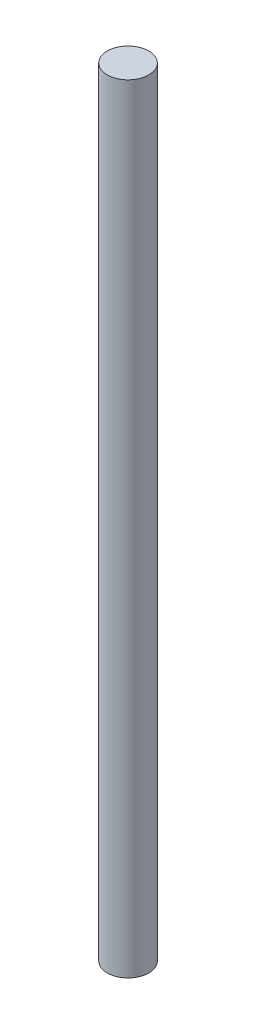
ISO-10303-21;
HEADER;
FILE_DESCRIPTION(('STEP AP214'),'2;1');
FILE_NAME('part.step','',(''),(''),'','','');
FILE_SCHEMA(('AUTOMOTIVE_DESIGN { 1 0 10303 214 1 1 1 1 }'));
ENDSEC;
DATA;
#1=APPLICATION_CONTEXT('core data for automotive mechanical design processes');
#2=APPLICATION_PROTOCOL_DEFINITION('international standard','automotive_design',2000,#1);
#3=PRODUCT_CONTEXT('',#1,'mechanical');
#4=PRODUCT('Part','Part','',(#3));
#5=PRODUCT_RELATED_PRODUCT_CATEGORY('part','',(#4));
#6=PRODUCT_DEFINITION_FORMATION('','',#4);
#7=PRODUCT_DEFINITION_CONTEXT('part definition',#1,'design');
#8=PRODUCT_DEFINITION('design','',#6,#7);
#9=PRODUCT_DEFINITION_SHAPE('','',#8);
#10=(LENGTH_UNIT() NAMED_UNIT(*) SI_UNIT(.MILLI.,.METRE.));
#11=(NAMED_UNIT(*) PLANE_ANGLE_UNIT() SI_UNIT($,.RADIAN.));
#12=(NAMED_UNIT(*) SI_UNIT($,.STERADIAN.) SOLID_ANGLE_UNIT());
#13=UNCERTAINTY_MEASURE_WITH_UNIT(LENGTH_MEASURE(1.E-05),#10,'distance_accuracy_value','');
#14=(GEOMETRIC_REPRESENTATION_CONTEXT(3) GLOBAL_UNCERTAINTY_ASSIGNED_CONTEXT((#13)) GLOBAL_UNIT_ASSIGNED_CONTEXT((#10,
#11,#12)) REPRESENTATION_CONTEXT('',''));
#15=CARTESIAN_POINT('',(0.,0.,0.));
#16=DIRECTION('',(0.,0.,1.));
#17=DIRECTION('',(1.,0.,0.));
#18=AXIS2_PLACEMENT_3D('',#15,#16,#17);
#19=CARTESIAN_POINT('',(0.,149.999999999999,0.));
#20=DIRECTION('',(0.,-0.999999999999993,0.));
#21=DIRECTION('',(0.,0.,-0.999999999999986));
#22=AXIS2_PLACEMENT_3D('',#19,#20,#21);
#23=CYLINDRICAL_SURFACE('',#22,4.);
#24=CARTESIAN_POINT('',(0.,149.999999999999,0.));
#25=DIRECTION('',(0.,0.999999999999993,0.));
#26=DIRECTION('',(0.,0.,0.999999999999986));
#27=AXIS2_PLACEMENT_3D('',#24,#25,#26);
#28=CIRCLE('',#27,4.);
#29=CARTESIAN_POINT('',(0.,149.999999999999,-3.99999999999997));
#30=VERTEX_POINT('',#29);
#31=EDGE_CURVE('E12',#30,#30,#28,.T.);
#32=CARTESIAN_POINT('',(0.,0.,0.));
#33=DIRECTION('',(0.,0.999999999999993,0.));
#34=DIRECTION('',(0.,0.,0.999999999999986));
#35=AXIS2_PLACEMENT_3D('',#32,#33,#34);
#36=CIRCLE('',#35,4.);
#37=CARTESIAN_POINT('',(0.,0.,-3.99999999999994));
#38=VERTEX_POINT('',#37);
#39=EDGE_CURVE('E45',#38,#38,#36,.T.);
#40=CARTESIAN_POINT('',(0.,149.999999999999,-3.99999999999997));
#41=CARTESIAN_POINT('',(0.,148.437499999999,-3.99999999999997));
#42=CARTESIAN_POINT('',(0.,146.874999999999,-3.99999999999997));
#43=CARTESIAN_POINT('',(0.,143.749999999999,-3.99999999999997));
#44=CARTESIAN_POINT('',(0.,142.187499999999,-3.99999999999997));
#45=CARTESIAN_POINT('',(0.,139.062499999999,-3.99999999999997));
#46=CARTESIAN_POINT('',(0.,137.499999999999,-3.99999999999997));
#47=CARTESIAN_POINT('',(0.,134.374999999999,-3.99999999999997));
#48=CARTESIAN_POINT('',(0.,132.812499999999,-3.99999999999997));
#49=CARTESIAN_POINT('',(0.,129.687499999999,-3.99999999999997));
#50=CARTESIAN_POINT('',(0.,128.124999999999,-3.99999999999997));
#51=CARTESIAN_POINT('',(0.,124.999999999999,-3.99999999999997));
#52=CARTESIAN_POINT('',(0.,123.437499999999,-3.99999999999996));
#53=CARTESIAN_POINT('',(0.,120.312499999999,-3.99999999999996));
#54=CARTESIAN_POINT('',(0.,118.749999999999,-3.99999999999996));
#55=CARTESIAN_POINT('',(0.,115.624999999999,-3.99999999999996));
#56=CARTESIAN_POINT('',(0.,114.062499999999,-3.99999999999996));
#57=CARTESIAN_POINT('',(0.,110.937499999999,-3.99999999999996));
#58=CARTESIAN_POINT('',(0.,109.374999999999,-3.99999999999996));
#59=CARTESIAN_POINT('',(0.,106.249999999999,-3.99999999999996));
#60=CARTESIAN_POINT('',(0.,104.687499999999,-3.99999999999996));
#61=CARTESIAN_POINT('',(0.,101.562499999999,-3.99999999999996));
#62=CARTESIAN_POINT('',(0.,99.9999999999994,-3.99999999999996));
#63=CARTESIAN_POINT('',(0.,96.8749999999994,-3.99999999999996));
#64=CARTESIAN_POINT('',(0.,95.3124999999994,-3.99999999999996));
#65=CARTESIAN_POINT('',(0.,92.1874999999994,-3.99999999999996));
#66=CARTESIAN_POINT('',(0.,90.6249999999994,-3.99999999999996));
#67=CARTESIAN_POINT('',(0.,87.4999999999995,-3.99999999999996));
#68=CARTESIAN_POINT('',(0.,85.9374999999995,-3.99999999999996));
#69=CARTESIAN_POINT('',(0.,82.8124999999995,-3.99999999999996));
#70=CARTESIAN_POINT('',(0.,81.2499999999995,-3.99999999999996));
#71=CARTESIAN_POINT('',(0.,78.1249999999995,-3.99999999999996));
#72=CARTESIAN_POINT('',(0.,76.5624999999995,-3.99999999999996));
#73=CARTESIAN_POINT('',(0.,73.4374999999995,-3.99999999999996));
#74=CARTESIAN_POINT('',(0.,71.8749999999995,-3.99999999999996));
#75=CARTESIAN_POINT('',(0.,68.7499999999996,-3.99999999999996));
#76=CARTESIAN_POINT('',(0.,67.1874999999996,-3.99999999999996));
#77=CARTESIAN_POINT('',(0.,64.0624999999996,-3.99999999999996));
#78=CARTESIAN_POINT('',(0.,62.4999999999996,-3.99999999999995));
#79=CARTESIAN_POINT('',(0.,59.3749999999996,-3.99999999999995));
#80=CARTESIAN_POINT('',(0.,57.8124999999996,-3.99999999999995));
#81=CARTESIAN_POINT('',(0.,54.6874999999997,-3.99999999999995));
#82=CARTESIAN_POINT('',(0.,53.1249999999997,-3.99999999999995));
#83=CARTESIAN_POINT('',(0.,49.9999999999997,-3.99999999999995));
#84=CARTESIAN_POINT('',(0.,48.4374999999997,-3.99999999999995));
#85=CARTESIAN_POINT('',(0.,45.3124999999997,-3.99999999999995));
#86=CARTESIAN_POINT('',(0.,43.7499999999997,-3.99999999999995));
#87=CARTESIAN_POINT('',(0.,40.6249999999997,-3.99999999999995));
#88=CARTESIAN_POINT('',(0.,39.0624999999998,-3.99999999999995));
#89=CARTESIAN_POINT('',(0.,35.9374999999998,-3.99999999999995));
#90=CARTESIAN_POINT('',(0.,34.3749999999998,-3.99999999999995));
#91=CARTESIAN_POINT('',(0.,31.2499999999998,-3.99999999999995));
#92=CARTESIAN_POINT('',(0.,29.6874999999998,-3.99999999999995));
#93=CARTESIAN_POINT('',(0.,26.5624999999998,-3.99999999999995));
#94=CARTESIAN_POINT('',(0.,24.9999999999998,-3.99999999999995));
#95=CARTESIAN_POINT('',(0.,21.8749999999999,-3.99999999999995));
#96=CARTESIAN_POINT('',(0.,20.3124999999999,-3.99999999999995));
#97=CARTESIAN_POINT('',(0.,17.1874999999999,-3.99999999999995));
#98=CARTESIAN_POINT('',(0.,15.6249999999999,-3.99999999999995));
#99=CARTESIAN_POINT('',(0.,12.4999999999999,-3.99999999999995));
#100=CARTESIAN_POINT('',(0.,10.9374999999999,-3.99999999999995));
#101=CARTESIAN_POINT('',(0.,7.81249999999993,-3.99999999999995));
#102=CARTESIAN_POINT('',(0.,6.24999999999994,-3.99999999999994));
#103=CARTESIAN_POINT('',(0.,3.12499999999996,-3.99999999999994));
#104=CARTESIAN_POINT('',(0.,1.56249999999997,-3.99999999999994));
#105=CARTESIAN_POINT('',(0.,0.,-3.99999999999994));
#106=B_SPLINE_CURVE_WITH_KNOTS('',3,(#40,#41,#42,#43,#44,#45,#46,#47,#48,#49,#50,#51,#52,#53,
#54,#55,#56,#57,#58,#59,#60,#61,#62,#63,#64,#65,#66,#67,#68,#69,#70,#71,#72,#73,#74,#75,#76,#77,
#78,#79,#80,#81,#82,#83,#84,#85,#86,#87,#88,#89,#90,#91,#92,#93,#94,#95,#96,#97,#98,#99,#100,
#101,#102,#103,#104,#105),.UNSPECIFIED.,.F.,.F.,(4,2,2,2,2,2,2,2,2,2,2,2,2,2,2,2,2,2,2,2,2,2,2,
2,2,2,2,2,2,2,2,2,4),(0.,4.68749999999996,9.37499999999994,14.0624999999999,18.7499999999999,
23.4374999999998,28.1249999999998,32.8124999999998,37.4999999999998,42.1874999999997,
46.8749999999997,51.5624999999997,56.2499999999996,60.9374999999996,65.6249999999996,
70.3124999999996,74.9999999999995,79.6874999999995,84.3749999999995,89.0624999999994,
93.7499999999994,98.4374999999994,103.124999999999,107.812499999999,112.499999999999,
117.187499999999,121.874999999999,126.562499999999,131.249999999999,135.937499999999,
140.624999999999,145.312499999999,149.999999999999),.UNSPECIFIED.);
#107=EDGE_CURVE('BSEAM42',#30,#38,#106,.T.);
#108=ORIENTED_EDGE('',*,*,#31,.F.);
#109=ORIENTED_EDGE('',*,*,#39,.T.);
#110=ORIENTED_EDGE('',*,*,#107,.T.);
#111=ORIENTED_EDGE('',*,*,#107,.F.);
#112=EDGE_LOOP('',(#108,#110,#109,#111));
#113=FACE_BOUND('',#112,.T.);
#114=ADVANCED_FACE('F42',(#113),#23,.T.);
#115=CARTESIAN_POINT('',(0.,149.999999999999,0.));
#116=DIRECTION('',(0.,0.999999999999993,0.));
#117=DIRECTION('',(0.,0.,0.999999999999986));
#118=AXIS2_PLACEMENT_3D('',#115,#116,#117);
#119=PLANE('',#118);
#120=ORIENTED_EDGE('',*,*,#31,.T.);
#121=EDGE_LOOP('',(#120));
#122=FACE_BOUND('',#121,.T.);
#123=ADVANCED_FACE('F57',(#122),#119,.T.);
#124=CARTESIAN_POINT('',(0.,0.,0.));
#125=DIRECTION('',(0.,0.999999999999993,0.));
#126=DIRECTION('',(0.,0.,0.999999999999986));
#127=AXIS2_PLACEMENT_3D('',#124,#125,#126);
#128=PLANE('',#127);
#129=ORIENTED_EDGE('',*,*,#39,.F.);
#130=EDGE_LOOP('',(#129));
#131=FACE_BOUND('',#130,.T.);
#132=ADVANCED_FACE('F55',(#131),#128,.F.);
#133=CLOSED_SHELL('',(#114,#123,#132));
#134=MANIFOLD_SOLID_BREP('B2',#133);
#135=ADVANCED_BREP_SHAPE_REPRESENTATION('',(#18,#134),#14);
#136=SHAPE_DEFINITION_REPRESENTATION(#9,#135);
ENDSEC;
END-ISO-10303-21;
